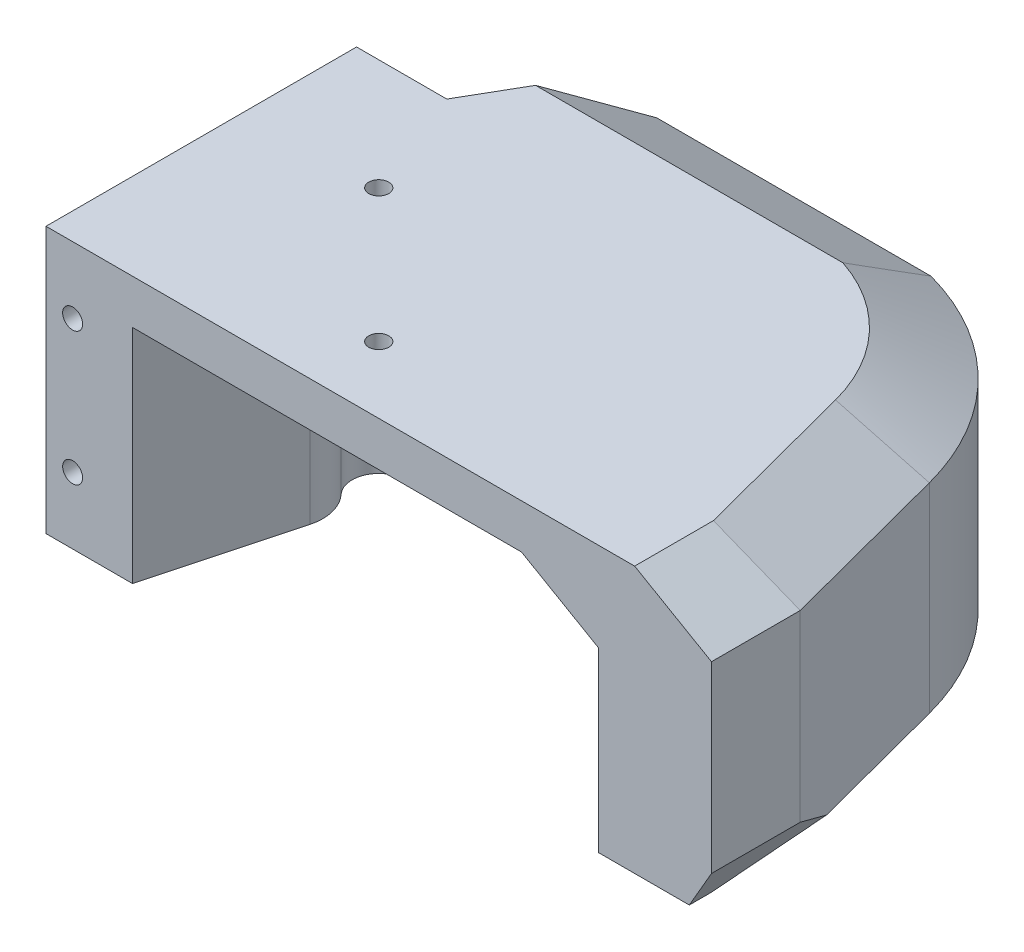
ISO-10303-21;
HEADER;
FILE_DESCRIPTION(('STEP AP214'),'2;1');
FILE_NAME('part.step','',(''),(''),'','','');
FILE_SCHEMA(('AUTOMOTIVE_DESIGN { 1 0 10303 214 1 1 1 1 }'));
ENDSEC;
DATA;
#1=APPLICATION_CONTEXT('core data for automotive mechanical design processes');
#2=APPLICATION_PROTOCOL_DEFINITION('international standard','automotive_design',2000,#1);
#3=PRODUCT_CONTEXT('',#1,'mechanical');
#4=PRODUCT('Part','Part','',(#3));
#5=PRODUCT_RELATED_PRODUCT_CATEGORY('part','',(#4));
#6=PRODUCT_DEFINITION_FORMATION('','',#4);
#7=PRODUCT_DEFINITION_CONTEXT('part definition',#1,'design');
#8=PRODUCT_DEFINITION('design','',#6,#7);
#9=PRODUCT_DEFINITION_SHAPE('','',#8);
#10=(LENGTH_UNIT() NAMED_UNIT(*) SI_UNIT(.MILLI.,.METRE.));
#11=(NAMED_UNIT(*) PLANE_ANGLE_UNIT() SI_UNIT($,.RADIAN.));
#12=(NAMED_UNIT(*) SI_UNIT($,.STERADIAN.) SOLID_ANGLE_UNIT());
#13=UNCERTAINTY_MEASURE_WITH_UNIT(LENGTH_MEASURE(1.E-05),#10,'distance_accuracy_value','');
#14=(GEOMETRIC_REPRESENTATION_CONTEXT(3) GLOBAL_UNCERTAINTY_ASSIGNED_CONTEXT((#13)) GLOBAL_UNIT_ASSIGNED_CONTEXT((#10,
#11,#12)) REPRESENTATION_CONTEXT('',''));
#15=CARTESIAN_POINT('',(0.,0.,0.));
#16=DIRECTION('',(0.,0.,1.));
#17=DIRECTION('',(1.,0.,0.));
#18=AXIS2_PLACEMENT_3D('',#15,#16,#17);
#19=CARTESIAN_POINT('',(30.,0.,55.));
#20=DIRECTION('',(0.,1.,0.));
#21=DIRECTION('',(0.,0.,1.));
#22=AXIS2_PLACEMENT_3D('',#19,#20,#21);
#23=CYLINDRICAL_SURFACE('',#22,2.25);
#24=CARTESIAN_POINT('',(30.,60.,55.));
#25=DIRECTION('',(0.,1.,0.));
#26=DIRECTION('',(0.,0.,1.));
#27=AXIS2_PLACEMENT_3D('',#24,#25,#26);
#28=CIRCLE('',#27,2.25);
#29=CARTESIAN_POINT('',(30.,60.,57.25));
#30=VERTEX_POINT('',#29);
#31=EDGE_CURVE('E521',#30,#30,#28,.T.);
#32=ORIENTED_EDGE('',*,*,#31,.T.);
#33=EDGE_LOOP('',(#32));
#34=FACE_BOUND('',#33,.T.);
#35=CARTESIAN_POINT('',(30.,53.,55.));
#36=DIRECTION('',(0.,-1.,0.));
#37=DIRECTION('',(0.,0.,-1.));
#38=AXIS2_PLACEMENT_3D('',#35,#36,#37);
#39=CIRCLE('',#38,2.25);
#40=CARTESIAN_POINT('',(30.,53.,52.75));
#41=VERTEX_POINT('',#40);
#42=EDGE_CURVE('E49',#41,#41,#39,.F.);
#43=ORIENTED_EDGE('',*,*,#42,.F.);
#44=EDGE_LOOP('',(#43));
#45=FACE_BOUND('',#44,.T.);
#46=ADVANCED_FACE('F44',(#34,#45),#23,.F.);
#47=CARTESIAN_POINT('',(60.,0.,85.));
#48=DIRECTION('',(0.,1.,0.));
#49=DIRECTION('',(0.,0.,1.));
#50=AXIS2_PLACEMENT_3D('',#47,#48,#49);
#51=CYLINDRICAL_SURFACE('',#50,2.25);
#52=CARTESIAN_POINT('',(60.,60.,85.));
#53=DIRECTION('',(0.,1.,0.));
#54=DIRECTION('',(0.,0.,1.));
#55=AXIS2_PLACEMENT_3D('',#52,#53,#54);
#56=CIRCLE('',#55,2.25);
#57=CARTESIAN_POINT('',(60.,60.,87.25));
#58=VERTEX_POINT('',#57);
#59=EDGE_CURVE('E525',#58,#58,#56,.T.);
#60=ORIENTED_EDGE('',*,*,#59,.T.);
#61=EDGE_LOOP('',(#60));
#62=FACE_BOUND('',#61,.T.);
#63=CARTESIAN_POINT('',(60.,53.,85.));
#64=DIRECTION('',(0.,-1.,0.));
#65=DIRECTION('',(0.,0.,-1.));
#66=AXIS2_PLACEMENT_3D('',#63,#64,#65);
#67=CIRCLE('',#66,2.25);
#68=CARTESIAN_POINT('',(60.,53.,82.75));
#69=VERTEX_POINT('',#68);
#70=EDGE_CURVE('E398',#69,#69,#67,.F.);
#71=ORIENTED_EDGE('',*,*,#70,.F.);
#72=EDGE_LOOP('',(#71));
#73=FACE_BOUND('',#72,.T.);
#74=ADVANCED_FACE('F613',(#62,#73),#51,.F.);
#75=CARTESIAN_POINT('',(43.1937476868986,50.,11.5737298107783));
#76=DIRECTION('',(0.965925826289067,0.,0.258819045102525));
#77=DIRECTION('',(0.258819045102525,0.,-0.965925826289067));
#78=AXIS2_PLACEMENT_3D('',#75,#76,#77);
#79=PLANE('',#78);
#80=DIRECTION('',(0.,-1.,0.));
#81=VECTOR('',#80,1.);
#82=CARTESIAN_POINT('',(35.436672602816,50.,40.5235281427008));
#83=LINE('',#82,#81);
#84=CARTESIAN_POINT('',(35.436672602816,40.,40.5235281427008));
#85=VERTEX_POINT('',#84);
#86=CARTESIAN_POINT('',(35.436672602816,0.,40.5235281427008));
#87=VERTEX_POINT('',#86);
#88=EDGE_CURVE('E490',#85,#87,#83,.T.);
#89=ORIENTED_EDGE('',*,*,#88,.F.);
#90=DIRECTION('',(0.242648450294152,-0.347927022767095,-0.905576344875611));
#91=VECTOR('',#90,1.);
#92=CARTESIAN_POINT('',(41.4104892942583,31.4343064895313,18.2289407351354));
#93=LINE('',#92,#91);
#94=CARTESIAN_POINT('',(34.9625251936436,40.6798670926029,42.2930703640092));
#95=VERTEX_POINT('',#94);
#96=EDGE_CURVE('E267',#85,#95,#93,.F.);
#97=ORIENTED_EDGE('',*,*,#96,.T.);
#98=DIRECTION('',(0.,1.,0.));
#99=VECTOR('',#98,1.);
#100=CARTESIAN_POINT('',(34.9625251936436,0.,42.2930703640092));
#101=LINE('',#100,#99);
#102=CARTESIAN_POINT('',(34.9625251936436,0.,42.2930703640092));
#103=VERTEX_POINT('',#102);
#104=EDGE_CURVE('E253',#95,#103,#101,.F.);
#105=ORIENTED_EDGE('',*,*,#104,.T.);
#106=DIRECTION('',(-0.258819045102525,0.,0.965925826289067));
#107=VECTOR('',#106,1.);
#108=CARTESIAN_POINT('',(43.1937476868986,0.,11.5737298107783));
#109=LINE('',#108,#107);
#110=EDGE_CURVE('E503',#87,#103,#109,.T.);
#111=ORIENTED_EDGE('',*,*,#110,.F.);
#112=EDGE_LOOP('',(#89,#97,#105,#111));
#113=FACE_BOUND('',#112,.T.);
#114=ADVANCED_FACE('F580',(#113),#79,.T.);
#115=CARTESIAN_POINT('',(0.,0.,100.));
#116=DIRECTION('',(0.,1.,0.));
#117=DIRECTION('',(0.,0.,1.));
#118=AXIS2_PLACEMENT_3D('',#115,#116,#117);
#119=PLANE('',#118);
#120=DIRECTION('',(0.499999999999997,0.,-0.86602540378444));
#121=VECTOR('',#120,1.);
#122=CARTESIAN_POINT('',(18.9996939578862,0.,32.3205080756905));
#123=LINE('',#122,#121);
#124=CARTESIAN_POINT('',(20.3394399200428,0.,30.));
#125=VERTEX_POINT('',#124);
#126=CARTESIAN_POINT('',(32.6599479957315,0.,8.66025403784442));
#127=VERTEX_POINT('',#126);
#128=EDGE_CURVE('E287',#125,#127,#123,.T.);
#129=ORIENTED_EDGE('',*,*,#128,.T.);
#130=DIRECTION('',(1.,0.,0.));
#131=VECTOR('',#130,1.);
#132=CARTESIAN_POINT('',(99.4666295470957,0.,8.66025403784443));
#133=LINE('',#132,#131);
#134=CARTESIAN_POINT('',(98.2607770074448,0.,8.66025403784443));
#135=VERTEX_POINT('',#134);
#136=EDGE_CURVE('E421',#127,#135,#133,.T.);
#137=ORIENTED_EDGE('',*,*,#136,.T.);
#138=CARTESIAN_POINT('',(84.5,0.,55.));
#139=DIRECTION('',(0.,1.,0.));
#140=DIRECTION('',(0.,0.,1.));
#141=AXIS2_PLACEMENT_3D('',#138,#139,#140);
#142=CIRCLE('',#141,48.3397459621556);
#143=CARTESIAN_POINT('',(131.253841762303,0.,42.7195553764817));
#144=VERTEX_POINT('',#143);
#145=EDGE_CURVE('E423',#135,#144,#142,.F.);
#146=ORIENTED_EDGE('',*,*,#145,.T.);
#147=DIRECTION('',(0.254044459255794,0.,0.967192541700685));
#148=VECTOR('',#147,1.);
#149=CARTESIAN_POINT('',(136.85727691863,0.,64.0528318706025));
#150=LINE('',#149,#148);
#151=CARTESIAN_POINT('',(145.,0.,95.0536301423143));
#152=VERTEX_POINT('',#151);
#153=EDGE_CURVE('E425',#144,#152,#150,.T.);
#154=ORIENTED_EDGE('',*,*,#153,.T.);
#155=DIRECTION('',(0.,0.,1.));
#156=VECTOR('',#155,1.);
#157=CARTESIAN_POINT('',(145.,0.,100.));
#158=LINE('',#157,#156);
#159=CARTESIAN_POINT('',(145.,0.,100.));
#160=VERTEX_POINT('',#159);
#161=EDGE_CURVE('E427',#152,#160,#158,.T.);
#162=ORIENTED_EDGE('',*,*,#161,.T.);
#163=DIRECTION('',(1.,0.,0.));
#164=VECTOR('',#163,1.);
#165=CARTESIAN_POINT('',(0.,0.,100.));
#166=LINE('',#165,#164);
#167=CARTESIAN_POINT('',(124.5,0.,100.));
#168=VERTEX_POINT('',#167);
#169=EDGE_CURVE('E477',#168,#160,#166,.T.);
#170=ORIENTED_EDGE('',*,*,#169,.F.);
#171=DIRECTION('',(0.,0.,-1.));
#172=VECTOR('',#171,1.);
#173=CARTESIAN_POINT('',(124.5,0.,0.));
#174=LINE('',#173,#172);
#175=CARTESIAN_POINT('',(124.5,0.,55.));
#176=VERTEX_POINT('',#175);
#177=EDGE_CURVE('E508',#168,#176,#174,.T.);
#178=ORIENTED_EDGE('',*,*,#177,.T.);
#179=CARTESIAN_POINT('',(84.5,0.,55.));
#180=DIRECTION('',(0.,-1.,0.));
#181=DIRECTION('',(0.,0.,-1.));
#182=AXIS2_PLACEMENT_3D('',#179,#180,#181);
#183=CIRCLE('',#182,40.);
#184=CARTESIAN_POINT('',(61.5569425459583,0.,22.2339182284402));
#185=VERTEX_POINT('',#184);
#186=EDGE_CURVE('E510',#185,#176,#183,.T.);
#187=ORIENTED_EDGE('',*,*,#186,.F.);
#188=DIRECTION('',(-0.819152044288995,0.,0.573576436351042));
#189=VECTOR('',#188,1.);
#190=CARTESIAN_POINT('',(30.6981385620608,0.,43.8414853981008));
#191=LINE('',#190,#189);
#192=EDGE_CURVE('E513',#185,#87,#191,.T.);
#193=ORIENTED_EDGE('',*,*,#192,.T.);
#194=ORIENTED_EDGE('',*,*,#110,.T.);
#195=CARTESIAN_POINT('',(25.3032669307529,0.,39.704879912984));
#196=DIRECTION('',(0.,1.,0.));
#197=DIRECTION('',(0.,0.,1.));
#198=AXIS2_PLACEMENT_3D('',#195,#196,#197);
#199=CIRCLE('',#198,10.);
#200=CARTESIAN_POINT('',(28.2387250990323,0.,49.264329967369));
#201=VERTEX_POINT('',#200);
#202=EDGE_CURVE('E257',#103,#201,#199,.F.);
#203=ORIENTED_EDGE('',*,*,#202,.T.);
#204=CARTESIAN_POINT('',(30.,0.,55.));
#205=DIRECTION('',(0.,-1.,0.));
#206=DIRECTION('',(0.,0.,-1.));
#207=AXIS2_PLACEMENT_3D('',#204,#205,#206);
#208=CIRCLE('',#207,6.);
#209=CARTESIAN_POINT('',(25.6068561763985,0.,59.0865985054997));
#210=VERTEX_POINT('',#209);
#211=EDGE_CURVE('E295',#210,#201,#208,.T.);
#212=ORIENTED_EDGE('',*,*,#211,.F.);
#213=CARTESIAN_POINT('',(18.2849498037295,0.,65.8975960146659));
#214=DIRECTION('',(0.,1.,0.));
#215=DIRECTION('',(0.,0.,1.));
#216=AXIS2_PLACEMENT_3D('',#213,#214,#215);
#217=CIRCLE('',#216,10.);
#218=CARTESIAN_POINT('',(27.9442080666201,0.,68.4857864656912));
#219=VERTEX_POINT('',#218);
#220=EDGE_CURVE('E255',#210,#219,#217,.F.);
#221=ORIENTED_EDGE('',*,*,#220,.T.);
#222=CARTESIAN_POINT('',(19.5,0.,100.));
#223=VERTEX_POINT('',#222);
#224=EDGE_CURVE('E507',#219,#223,#109,.T.);
#225=ORIENTED_EDGE('',*,*,#224,.T.);
#226=CARTESIAN_POINT('',(0.,0.,100.));
#227=VERTEX_POINT('',#226);
#228=EDGE_CURVE('E481',#227,#223,#166,.T.);
#229=ORIENTED_EDGE('',*,*,#228,.F.);
#230=DIRECTION('',(0.,0.,-1.));
#231=VECTOR('',#230,1.);
#232=CARTESIAN_POINT('',(0.,0.,100.));
#233=LINE('',#232,#231);
#234=CARTESIAN_POINT('',(0.,0.,30.));
#235=VERTEX_POINT('',#234);
#236=EDGE_CURVE('E237',#227,#235,#233,.T.);
#237=ORIENTED_EDGE('',*,*,#236,.T.);
#238=DIRECTION('',(-1.,0.,0.));
#239=VECTOR('',#238,1.);
#240=CARTESIAN_POINT('',(19.6214722227974,0.,30.));
#241=LINE('',#240,#239);
#242=EDGE_CURVE('E217',#125,#235,#241,.T.);
#243=ORIENTED_EDGE('',*,*,#242,.F.);
#244=EDGE_LOOP('',(#129,#137,#146,#154,#162,#170,#178,#187,#193,#194,#203,#212,#221,#225,#229,
#237,#243));
#245=FACE_BOUND('',#244,.T.);
#246=ADVANCED_FACE('F468',(#245),#119,.F.);
#247=CARTESIAN_POINT('',(0.,0.,100.));
#248=DIRECTION('',(0.,0.,-1.));
#249=DIRECTION('',(-1.,0.,0.));
#250=AXIS2_PLACEMENT_3D('',#247,#248,#249);
#251=PLANE('',#250);
#252=CARTESIAN_POINT('',(5.99999999999998,15.,100.));
#253=DIRECTION('',(0.,0.,1.));
#254=DIRECTION('',(1.,0.,0.));
#255=AXIS2_PLACEMENT_3D('',#252,#253,#254);
#256=CIRCLE('',#255,2.25);
#257=CARTESIAN_POINT('',(8.24999999999998,15.,100.));
#258=VERTEX_POINT('',#257);
#259=EDGE_CURVE('E487',#258,#258,#256,.T.);
#260=ORIENTED_EDGE('',*,*,#259,.F.);
#261=EDGE_LOOP('',(#260));
#262=FACE_BOUND('',#261,.T.);
#263=CARTESIAN_POINT('',(5.99999999999998,45.,100.));
#264=DIRECTION('',(0.,0.,1.));
#265=DIRECTION('',(1.,0.,0.));
#266=AXIS2_PLACEMENT_3D('',#263,#264,#265);
#267=CIRCLE('',#266,2.25);
#268=CARTESIAN_POINT('',(8.24999999999998,45.,100.));
#269=VERTEX_POINT('',#268);
#270=EDGE_CURVE('E484',#269,#269,#267,.T.);
#271=ORIENTED_EDGE('',*,*,#270,.F.);
#272=EDGE_LOOP('',(#271));
#273=FACE_BOUND('',#272,.T.);
#274=ORIENTED_EDGE('',*,*,#169,.T.);
#275=DIRECTION('',(-0.500000000000001,-0.866025403784438,0.));
#276=VECTOR('',#275,1.);
#277=CARTESIAN_POINT('',(150.,8.66025403784443,100.));
#278=LINE('',#277,#276);
#279=CARTESIAN_POINT('',(150.,8.66025403784443,100.));
#280=VERTEX_POINT('',#279);
#281=EDGE_CURVE('E11',#160,#280,#278,.F.);
#282=ORIENTED_EDGE('',*,*,#281,.T.);
#283=DIRECTION('',(0.,1.,0.));
#284=VECTOR('',#283,1.);
#285=CARTESIAN_POINT('',(150.,0.,100.));
#286=LINE('',#285,#284);
#287=CARTESIAN_POINT('',(150.,50.,100.));
#288=VERTEX_POINT('',#287);
#289=EDGE_CURVE('E242',#280,#288,#286,.T.);
#290=ORIENTED_EDGE('',*,*,#289,.T.);
#291=DIRECTION('',(0.866025403784438,-0.5,0.));
#292=VECTOR('',#291,1.);
#293=CARTESIAN_POINT('',(132.679491924311,60.,100.));
#294=LINE('',#293,#292);
#295=CARTESIAN_POINT('',(132.679491924311,60.,100.));
#296=VERTEX_POINT('',#295);
#297=EDGE_CURVE('E318',#288,#296,#294,.F.);
#298=ORIENTED_EDGE('',*,*,#297,.T.);
#299=DIRECTION('',(-1.,0.,0.));
#300=VECTOR('',#299,1.);
#301=CARTESIAN_POINT('',(0.,60.,100.));
#302=LINE('',#301,#300);
#303=CARTESIAN_POINT('',(0.,60.,100.));
#304=VERTEX_POINT('',#303);
#305=EDGE_CURVE('E238',#296,#304,#302,.T.);
#306=ORIENTED_EDGE('',*,*,#305,.T.);
#307=DIRECTION('',(0.,-1.,0.));
#308=VECTOR('',#307,1.);
#309=CARTESIAN_POINT('',(0.,0.,100.));
#310=LINE('',#309,#308);
#311=EDGE_CURVE('E236',#304,#227,#310,.T.);
#312=ORIENTED_EDGE('',*,*,#311,.T.);
#313=ORIENTED_EDGE('',*,*,#228,.T.);
#314=DIRECTION('',(0.,-1.,0.));
#315=VECTOR('',#314,1.);
#316=CARTESIAN_POINT('',(19.5,50.,100.));
#317=LINE('',#316,#315);
#318=CARTESIAN_POINT('',(19.5,50.,100.));
#319=VERTEX_POINT('',#318);
#320=EDGE_CURVE('E499',#319,#223,#317,.T.);
#321=ORIENTED_EDGE('',*,*,#320,.F.);
#322=DIRECTION('',(-1.,0.,0.));
#323=VECTOR('',#322,1.);
#324=CARTESIAN_POINT('',(0.,50.,100.));
#325=LINE('',#324,#323);
#326=CARTESIAN_POINT('',(107.179491924311,50.,100.));
#327=VERTEX_POINT('',#326);
#328=EDGE_CURVE('E506',#327,#319,#325,.T.);
#329=ORIENTED_EDGE('',*,*,#328,.F.);
#330=DIRECTION('',(-0.866025403784442,0.499999999999995,0.));
#331=VECTOR('',#330,1.);
#332=CARTESIAN_POINT('',(48.445508075688,83.9100813855811,100.));
#333=LINE('',#332,#331);
#334=CARTESIAN_POINT('',(124.5,40.,100.));
#335=VERTEX_POINT('',#334);
#336=EDGE_CURVE('E285',#327,#335,#333,.F.);
#337=ORIENTED_EDGE('',*,*,#336,.T.);
#338=DIRECTION('',(0.,-1.,0.));
#339=VECTOR('',#338,1.);
#340=CARTESIAN_POINT('',(124.5,50.,100.));
#341=LINE('',#340,#339);
#342=EDGE_CURVE('E479',#335,#168,#341,.T.);
#343=ORIENTED_EDGE('',*,*,#342,.T.);
#344=EDGE_LOOP('',(#274,#282,#290,#298,#306,#312,#313,#321,#329,#337,#343));
#345=FACE_BOUND('',#344,.T.);
#346=ADVANCED_FACE('F458',(#262,#273,#345),#251,.F.);
#347=CARTESIAN_POINT('',(0.,0.,100.));
#348=DIRECTION('',(1.,0.,0.));
#349=DIRECTION('',(0.,1.,0.));
#350=AXIS2_PLACEMENT_3D('',#347,#348,#349);
#351=PLANE('',#350);
#352=DIRECTION('',(0.,0.,-1.));
#353=VECTOR('',#352,1.);
#354=CARTESIAN_POINT('',(0.,60.,100.));
#355=LINE('',#354,#353);
#356=CARTESIAN_POINT('',(0.,60.,30.));
#357=VERTEX_POINT('',#356);
#358=EDGE_CURVE('E228',#304,#357,#355,.T.);
#359=ORIENTED_EDGE('',*,*,#358,.T.);
#360=DIRECTION('',(0.,-1.,0.));
#361=VECTOR('',#360,1.);
#362=CARTESIAN_POINT('',(0.,60.,30.));
#363=LINE('',#362,#361);
#364=EDGE_CURVE('E210',#357,#235,#363,.T.);
#365=ORIENTED_EDGE('',*,*,#364,.T.);
#366=ORIENTED_EDGE('',*,*,#236,.F.);
#367=ORIENTED_EDGE('',*,*,#311,.F.);
#368=EDGE_LOOP('',(#359,#365,#366,#367));
#369=FACE_BOUND('',#368,.T.);
#370=ADVANCED_FACE('F234',(#369),#351,.F.);
#371=CARTESIAN_POINT('',(150.,0.,100.));
#372=DIRECTION('',(-1.,0.,0.));
#373=DIRECTION('',(0.,0.,1.));
#374=AXIS2_PLACEMENT_3D('',#371,#372,#373);
#375=PLANE('',#374);
#376=ORIENTED_EDGE('',*,*,#289,.F.);
#377=DIRECTION('',(0.,0.,-1.));
#378=VECTOR('',#377,1.);
#379=CARTESIAN_POINT('',(150.,8.66025403784443,100.));
#380=LINE('',#379,#378);
#381=CARTESIAN_POINT('',(150.,8.66025403784443,80.));
#382=VERTEX_POINT('',#381);
#383=EDGE_CURVE('E54',#280,#382,#380,.T.);
#384=ORIENTED_EDGE('',*,*,#383,.T.);
#385=DIRECTION('',(0.,-1.,0.));
#386=VECTOR('',#385,1.);
#387=CARTESIAN_POINT('',(150.,60.,80.));
#388=LINE('',#387,#386);
#389=CARTESIAN_POINT('',(150.,50.,80.));
#390=VERTEX_POINT('',#389);
#391=EDGE_CURVE('E446',#390,#382,#388,.T.);
#392=ORIENTED_EDGE('',*,*,#391,.F.);
#393=DIRECTION('',(0.,0.,1.));
#394=VECTOR('',#393,1.);
#395=CARTESIAN_POINT('',(150.,50.,100.));
#396=LINE('',#395,#394);
#397=EDGE_CURVE('E315',#390,#288,#396,.T.);
#398=ORIENTED_EDGE('',*,*,#397,.T.);
#399=EDGE_LOOP('',(#376,#384,#392,#398));
#400=FACE_BOUND('',#399,.T.);
#401=ADVANCED_FACE('F452',(#400),#375,.F.);
#402=CARTESIAN_POINT('',(0.,60.,100.));
#403=DIRECTION('',(0.,-1.,0.));
#404=DIRECTION('',(0.,0.,-1.));
#405=AXIS2_PLACEMENT_3D('',#402,#403,#404);
#406=PLANE('',#405);
#407=ORIENTED_EDGE('',*,*,#31,.F.);
#408=EDGE_LOOP('',(#407));
#409=FACE_BOUND('',#408,.T.);
#410=ORIENTED_EDGE('',*,*,#59,.F.);
#411=EDGE_LOOP('',(#410));
#412=FACE_BOUND('',#411,.T.);
#413=DIRECTION('',(-0.499999999999997,0.,0.86602540378444));
#414=VECTOR('',#413,1.);
#415=CARTESIAN_POINT('',(18.9996939578862,60.,32.3205080756905));
#416=LINE('',#415,#414);
#417=CARTESIAN_POINT('',(27.6599479957315,60.,17.3205080756888));
#418=VERTEX_POINT('',#417);
#419=CARTESIAN_POINT('',(20.3394399200428,60.,30.));
#420=VERTEX_POINT('',#419);
#421=EDGE_CURVE('E231',#418,#420,#416,.T.);
#422=ORIENTED_EDGE('',*,*,#421,.T.);
#423=DIRECTION('',(-1.,0.,0.));
#424=VECTOR('',#423,1.);
#425=CARTESIAN_POINT('',(19.6214722227974,60.,30.));
#426=LINE('',#425,#424);
#427=EDGE_CURVE('E215',#420,#357,#426,.T.);
#428=ORIENTED_EDGE('',*,*,#427,.T.);
#429=ORIENTED_EDGE('',*,*,#358,.F.);
#430=ORIENTED_EDGE('',*,*,#305,.F.);
#431=DIRECTION('',(0.,0.,-1.));
#432=VECTOR('',#431,1.);
#433=CARTESIAN_POINT('',(132.679491924311,60.,100.));
#434=LINE('',#433,#432);
#435=CARTESIAN_POINT('',(132.679491924311,60.,82.2367811054835));
#436=VERTEX_POINT('',#435);
#437=EDGE_CURVE('E302',#296,#436,#434,.T.);
#438=ORIENTED_EDGE('',*,*,#437,.T.);
#439=DIRECTION('',(-0.254044459255794,0.,-0.967192541700685));
#440=VECTOR('',#439,1.);
#441=CARTESIAN_POINT('',(128.481143803994,60.,66.2529214246645));
#442=LINE('',#441,#440);
#443=CARTESIAN_POINT('',(122.877708647666,60.,44.9196449305437));
#444=VERTEX_POINT('',#443);
#445=EDGE_CURVE('E304',#436,#444,#442,.T.);
#446=ORIENTED_EDGE('',*,*,#445,.T.);
#447=CARTESIAN_POINT('',(84.5,60.,55.));
#448=DIRECTION('',(0.,-1.,0.));
#449=DIRECTION('',(0.,0.,-1.));
#450=AXIS2_PLACEMENT_3D('',#447,#448,#449);
#451=CIRCLE('',#450,39.6794919243112);
#452=CARTESIAN_POINT('',(96.9385677510413,60.,17.3205080756888));
#453=VERTEX_POINT('',#452);
#454=EDGE_CURVE('E306',#444,#453,#451,.F.);
#455=ORIENTED_EDGE('',*,*,#454,.T.);
#456=DIRECTION('',(-1.,0.,0.));
#457=VECTOR('',#456,1.);
#458=CARTESIAN_POINT('',(27.6599479957312,60.,17.3205080756888));
#459=LINE('',#458,#457);
#460=EDGE_CURVE('E308',#453,#418,#459,.T.);
#461=ORIENTED_EDGE('',*,*,#460,.T.);
#462=EDGE_LOOP('',(#422,#428,#429,#430,#438,#446,#455,#461));
#463=FACE_BOUND('',#462,.T.);
#464=ADVANCED_FACE('F226',(#409,#412,#463),#406,.F.);
#465=CARTESIAN_POINT('',(0.,0.,0.));
#466=DIRECTION('',(0.,0.,-1.));
#467=DIRECTION('',(-1.,0.,0.));
#468=AXIS2_PLACEMENT_3D('',#465,#466,#467);
#469=PLANE('',#468);
#470=DIRECTION('',(0.,-1.,0.));
#471=VECTOR('',#470,1.);
#472=CARTESIAN_POINT('',(99.4666295470957,60.,0.));
#473=LINE('',#472,#471);
#474=CARTESIAN_POINT('',(99.4666295470957,50.,0.));
#475=VERTEX_POINT('',#474);
#476=CARTESIAN_POINT('',(99.4666295470957,5.00000000000003,0.));
#477=VERTEX_POINT('',#476);
#478=EDGE_CURVE('E455',#475,#477,#473,.T.);
#479=ORIENTED_EDGE('',*,*,#478,.T.);
#480=DIRECTION('',(-1.,0.,0.));
#481=VECTOR('',#480,1.);
#482=CARTESIAN_POINT('',(37.6599479957314,5.00000000000003,0.));
#483=LINE('',#482,#481);
#484=CARTESIAN_POINT('',(37.6599479957314,5.00000000000003,0.));
#485=VERTEX_POINT('',#484);
#486=EDGE_CURVE('E68',#477,#485,#483,.T.);
#487=ORIENTED_EDGE('',*,*,#486,.T.);
#488=DIRECTION('',(0.,1.,0.));
#489=VECTOR('',#488,1.);
#490=CARTESIAN_POINT('',(37.6599479957314,60.,0.));
#491=LINE('',#490,#489);
#492=CARTESIAN_POINT('',(37.6599479957314,50.,0.));
#493=VERTEX_POINT('',#492);
#494=EDGE_CURVE('E300',#485,#493,#491,.T.);
#495=ORIENTED_EDGE('',*,*,#494,.T.);
#496=DIRECTION('',(1.,0.,0.));
#497=VECTOR('',#496,1.);
#498=CARTESIAN_POINT('',(99.4666295470957,50.,0.));
#499=LINE('',#498,#497);
#500=EDGE_CURVE('E298',#493,#475,#499,.T.);
#501=ORIENTED_EDGE('',*,*,#500,.T.);
#502=EDGE_LOOP('',(#479,#487,#495,#501));
#503=FACE_BOUND('',#502,.T.);
#504=ADVANCED_FACE('F648',(#503),#469,.T.);
#505=CARTESIAN_POINT('',(5.99999999999998,15.,0.));
#506=DIRECTION('',(0.,0.,1.));
#507=DIRECTION('',(1.,0.,0.));
#508=AXIS2_PLACEMENT_3D('',#505,#506,#507);
#509=CYLINDRICAL_SURFACE('',#508,2.25);
#510=CARTESIAN_POINT('',(5.99999999999998,15.,30.));
#511=DIRECTION('',(0.,0.,1.));
#512=DIRECTION('',(1.,0.,0.));
#513=AXIS2_PLACEMENT_3D('',#510,#511,#512);
#514=CIRCLE('',#513,2.25);
#515=CARTESIAN_POINT('',(8.24999999999998,15.,30.));
#516=VERTEX_POINT('',#515);
#517=EDGE_CURVE('E248',#516,#516,#514,.F.);
#518=ORIENTED_EDGE('',*,*,#517,.T.);
#519=EDGE_LOOP('',(#518));
#520=FACE_BOUND('',#519,.T.);
#521=ORIENTED_EDGE('',*,*,#259,.T.);
#522=EDGE_LOOP('',(#521));
#523=FACE_BOUND('',#522,.T.);
#524=ADVANCED_FACE('F644',(#520,#523),#509,.F.);
#525=CARTESIAN_POINT('',(5.99999999999998,45.,0.));
#526=DIRECTION('',(0.,0.,1.));
#527=DIRECTION('',(1.,0.,0.));
#528=AXIS2_PLACEMENT_3D('',#525,#526,#527);
#529=CYLINDRICAL_SURFACE('',#528,2.25);
#530=CARTESIAN_POINT('',(5.99999999999998,45.,30.));
#531=DIRECTION('',(0.,0.,1.));
#532=DIRECTION('',(1.,0.,0.));
#533=AXIS2_PLACEMENT_3D('',#530,#531,#532);
#534=CIRCLE('',#533,2.25);
#535=CARTESIAN_POINT('',(8.24999999999998,45.,30.));
#536=VERTEX_POINT('',#535);
#537=EDGE_CURVE('E222',#536,#536,#534,.F.);
#538=ORIENTED_EDGE('',*,*,#537,.T.);
#539=EDGE_LOOP('',(#538));
#540=FACE_BOUND('',#539,.T.);
#541=ORIENTED_EDGE('',*,*,#270,.T.);
#542=EDGE_LOOP('',(#541));
#543=FACE_BOUND('',#542,.T.);
#544=ADVANCED_FACE('F610',(#540,#543),#529,.F.);
#545=CARTESIAN_POINT('',(30.6981385620608,50.,43.8414853981008));
#546=DIRECTION('',(0.573576436351042,0.,0.819152044288995));
#547=DIRECTION('',(0.819152044288995,0.,-0.573576436351042));
#548=AXIS2_PLACEMENT_3D('',#545,#546,#547);
#549=PLANE('',#548);
#550=DIRECTION('',(0.,-1.,0.));
#551=VECTOR('',#550,1.);
#552=CARTESIAN_POINT('',(61.5569425459583,50.,22.2339182284402));
#553=LINE('',#552,#551);
#554=CARTESIAN_POINT('',(61.5569425459583,40.,22.2339182284402));
#555=VERTEX_POINT('',#554);
#556=EDGE_CURVE('E493',#555,#185,#553,.T.);
#557=ORIENTED_EDGE('',*,*,#556,.F.);
#558=DIRECTION('',(-0.819152044288995,0.,0.573576436351042));
#559=VECTOR('',#558,1.);
#560=CARTESIAN_POINT('',(35.436672602816,40.,40.5235281427008));
#561=LINE('',#560,#559);
#562=EDGE_CURVE('E264',#555,#85,#561,.T.);
#563=ORIENTED_EDGE('',*,*,#562,.T.);
#564=ORIENTED_EDGE('',*,*,#88,.T.);
#565=ORIENTED_EDGE('',*,*,#192,.F.);
#566=EDGE_LOOP('',(#557,#563,#564,#565));
#567=FACE_BOUND('',#566,.T.);
#568=ADVANCED_FACE('F576',(#567),#549,.T.);
#569=ORIENTED_EDGE('',*,*,#224,.F.);
#570=DIRECTION('',(0.,1.,0.));
#571=VECTOR('',#570,1.);
#572=CARTESIAN_POINT('',(27.9442080666201,50.,68.4857864656912));
#573=LINE('',#572,#571);
#574=CARTESIAN_POINT('',(27.9442080666201,50.,68.4857864656912));
#575=VERTEX_POINT('',#574);
#576=EDGE_CURVE('E259',#219,#575,#573,.T.);
#577=ORIENTED_EDGE('',*,*,#576,.T.);
#578=DIRECTION('',(-0.258819045102525,0.,0.965925826289067));
#579=VECTOR('',#578,1.);
#580=CARTESIAN_POINT('',(43.1937476868986,50.,11.5737298107783));
#581=LINE('',#580,#579);
#582=EDGE_CURVE('E496',#575,#319,#581,.T.);
#583=ORIENTED_EDGE('',*,*,#582,.T.);
#584=ORIENTED_EDGE('',*,*,#320,.T.);
#585=EDGE_LOOP('',(#569,#577,#583,#584));
#586=FACE_BOUND('',#585,.T.);
#587=ADVANCED_FACE('F600',(#586),#79,.T.);
#588=CARTESIAN_POINT('',(124.5,50.,0.));
#589=DIRECTION('',(-1.,0.,0.));
#590=DIRECTION('',(0.,0.,1.));
#591=AXIS2_PLACEMENT_3D('',#588,#589,#590);
#592=PLANE('',#591);
#593=ORIENTED_EDGE('',*,*,#342,.F.);
#594=DIRECTION('',(0.,0.,-1.));
#595=VECTOR('',#594,1.);
#596=CARTESIAN_POINT('',(124.5,40.,55.));
#597=LINE('',#596,#595);
#598=CARTESIAN_POINT('',(124.5,40.,55.));
#599=VERTEX_POINT('',#598);
#600=EDGE_CURVE('E281',#335,#599,#597,.T.);
#601=ORIENTED_EDGE('',*,*,#600,.T.);
#602=DIRECTION('',(0.,-1.,0.));
#603=VECTOR('',#602,1.);
#604=CARTESIAN_POINT('',(124.5,50.,55.));
#605=LINE('',#604,#603);
#606=EDGE_CURVE('E495',#599,#176,#605,.T.);
#607=ORIENTED_EDGE('',*,*,#606,.T.);
#608=ORIENTED_EDGE('',*,*,#177,.F.);
#609=EDGE_LOOP('',(#593,#601,#607,#608));
#610=FACE_BOUND('',#609,.T.);
#611=ADVANCED_FACE('F568',(#610),#592,.T.);
#612=CARTESIAN_POINT('',(84.5,50.,55.));
#613=DIRECTION('',(0.,-1.,0.));
#614=DIRECTION('',(0.,0.,-1.));
#615=AXIS2_PLACEMENT_3D('',#612,#613,#614);
#616=CYLINDRICAL_SURFACE('',#615,40.);
#617=ORIENTED_EDGE('',*,*,#606,.F.);
#618=CARTESIAN_POINT('',(84.5,40.,55.));
#619=DIRECTION('',(0.,-1.,0.));
#620=DIRECTION('',(0.,0.,-1.));
#621=AXIS2_PLACEMENT_3D('',#618,#619,#620);
#622=CIRCLE('',#621,40.);
#623=EDGE_CURVE('E283',#599,#555,#622,.F.);
#624=ORIENTED_EDGE('',*,*,#623,.T.);
#625=ORIENTED_EDGE('',*,*,#556,.T.);
#626=ORIENTED_EDGE('',*,*,#186,.T.);
#627=EDGE_LOOP('',(#617,#624,#625,#626));
#628=FACE_BOUND('',#627,.T.);
#629=ADVANCED_FACE('F573',(#628),#616,.F.);
#630=CARTESIAN_POINT('',(0.,50.,0.));
#631=DIRECTION('',(0.,-1.,0.));
#632=DIRECTION('',(0.,0.,-1.));
#633=AXIS2_PLACEMENT_3D('',#630,#631,#632);
#634=PLANE('',#633);
#635=CARTESIAN_POINT('',(60.,50.,85.));
#636=DIRECTION('',(0.,-1.,0.));
#637=DIRECTION('',(0.,0.,-1.));
#638=AXIS2_PLACEMENT_3D('',#635,#636,#637);
#639=CIRCLE('',#638,4.50000000000001);
#640=CARTESIAN_POINT('',(60.,50.,80.5));
#641=VERTEX_POINT('',#640);
#642=EDGE_CURVE('E401',#641,#641,#639,.F.);
#643=ORIENTED_EDGE('',*,*,#642,.T.);
#644=EDGE_LOOP('',(#643));
#645=FACE_BOUND('',#644,.T.);
#646=CARTESIAN_POINT('',(18.2849498037295,50.,65.8975960146659));
#647=DIRECTION('',(0.,-1.,0.));
#648=DIRECTION('',(0.,0.,-1.));
#649=AXIS2_PLACEMENT_3D('',#646,#647,#648);
#650=CIRCLE('',#649,10.);
#651=CARTESIAN_POINT('',(28.2528558148857,50.,66.6981269339657));
#652=VERTEX_POINT('',#651);
#653=EDGE_CURVE('E261',#575,#652,#650,.F.);
#654=ORIENTED_EDGE('',*,*,#653,.T.);
#655=DIRECTION('',(0.819152044288995,0.,-0.573576436351042));
#656=VECTOR('',#655,1.);
#657=CARTESIAN_POINT('',(71.4915778438015,50.,36.422047826765));
#658=LINE('',#657,#656);
#659=CARTESIAN_POINT('',(71.4915778438015,50.,36.4220478267649));
#660=VERTEX_POINT('',#659);
#661=EDGE_CURVE('E279',#652,#660,#658,.T.);
#662=ORIENTED_EDGE('',*,*,#661,.T.);
#663=CARTESIAN_POINT('',(84.5,50.,55.));
#664=DIRECTION('',(0.,-1.,0.));
#665=DIRECTION('',(0.,0.,-1.));
#666=AXIS2_PLACEMENT_3D('',#663,#664,#665);
#667=CIRCLE('',#666,22.6794919243109);
#668=CARTESIAN_POINT('',(107.179491924311,50.,55.));
#669=VERTEX_POINT('',#668);
#670=EDGE_CURVE('E275',#660,#669,#667,.T.);
#671=ORIENTED_EDGE('',*,*,#670,.T.);
#672=DIRECTION('',(0.,0.,1.));
#673=VECTOR('',#672,1.);
#674=CARTESIAN_POINT('',(107.179491924311,50.,100.));
#675=LINE('',#674,#673);
#676=EDGE_CURVE('E277',#669,#327,#675,.T.);
#677=ORIENTED_EDGE('',*,*,#676,.T.);
#678=ORIENTED_EDGE('',*,*,#328,.T.);
#679=ORIENTED_EDGE('',*,*,#582,.F.);
#680=EDGE_LOOP('',(#654,#662,#671,#677,#678,#679));
#681=FACE_BOUND('',#680,.T.);
#682=ADVANCED_FACE('F560',(#645,#681),#634,.T.);
#683=CARTESIAN_POINT('',(19.6214722227974,60.,30.));
#684=DIRECTION('',(0.,0.,1.));
#685=DIRECTION('',(1.,0.,0.));
#686=AXIS2_PLACEMENT_3D('',#683,#684,#685);
#687=PLANE('',#686);
#688=ORIENTED_EDGE('',*,*,#537,.F.);
#689=EDGE_LOOP('',(#688));
#690=FACE_BOUND('',#689,.T.);
#691=ORIENTED_EDGE('',*,*,#242,.T.);
#692=ORIENTED_EDGE('',*,*,#364,.F.);
#693=ORIENTED_EDGE('',*,*,#427,.F.);
#694=DIRECTION('',(0.,-1.,0.));
#695=VECTOR('',#694,1.);
#696=CARTESIAN_POINT('',(20.3394399200428,60.,30.));
#697=LINE('',#696,#695);
#698=EDGE_CURVE('E320',#420,#125,#697,.T.);
#699=ORIENTED_EDGE('',*,*,#698,.T.);
#700=EDGE_LOOP('',(#691,#692,#693,#699));
#701=FACE_BOUND('',#700,.T.);
#702=ORIENTED_EDGE('',*,*,#517,.F.);
#703=EDGE_LOOP('',(#702));
#704=FACE_BOUND('',#703,.T.);
#705=ADVANCED_FACE('F212',(#690,#701,#704),#687,.F.);
#706=CARTESIAN_POINT('',(84.5,60.,55.));
#707=DIRECTION('',(0.,-1.,0.));
#708=DIRECTION('',(0.,0.,-1.));
#709=AXIS2_PLACEMENT_3D('',#706,#707,#708);
#710=CYLINDRICAL_SURFACE('',#709,57.);
#711=DIRECTION('',(0.,-1.,0.));
#712=VECTOR('',#711,1.);
#713=CARTESIAN_POINT('',(139.629974876939,60.,40.5194658224197));
#714=LINE('',#713,#712);
#715=CARTESIAN_POINT('',(139.629974876939,50.,40.5194658224197));
#716=VERTEX_POINT('',#715);
#717=CARTESIAN_POINT('',(139.629974876939,5.00000000000003,40.5194658224197));
#718=VERTEX_POINT('',#717);
#719=EDGE_CURVE('E449',#716,#718,#714,.T.);
#720=ORIENTED_EDGE('',*,*,#719,.T.);
#721=CARTESIAN_POINT('',(84.5,5.00000000000003,55.));
#722=DIRECTION('',(0.,1.,0.));
#723=DIRECTION('',(0.,0.,1.));
#724=AXIS2_PLACEMENT_3D('',#721,#722,#723);
#725=CIRCLE('',#724,57.);
#726=EDGE_CURVE('E419',#718,#477,#725,.T.);
#727=ORIENTED_EDGE('',*,*,#726,.T.);
#728=ORIENTED_EDGE('',*,*,#478,.F.);
#729=CARTESIAN_POINT('',(84.5,50.,55.));
#730=DIRECTION('',(0.,-1.,0.));
#731=DIRECTION('',(0.,0.,-1.));
#732=AXIS2_PLACEMENT_3D('',#729,#730,#731);
#733=CIRCLE('',#732,57.);
#734=EDGE_CURVE('E313',#475,#716,#733,.T.);
#735=ORIENTED_EDGE('',*,*,#734,.T.);
#736=EDGE_LOOP('',(#720,#727,#728,#735));
#737=FACE_BOUND('',#736,.T.);
#738=ADVANCED_FACE('F628',(#737),#710,.T.);
#739=CARTESIAN_POINT('',(139.629974876939,60.,40.5194658224197));
#740=DIRECTION('',(-0.967192541700685,0.,0.254044459255794));
#741=DIRECTION('',(0.254044459255794,0.,0.967192541700685));
#742=AXIS2_PLACEMENT_3D('',#739,#740,#741);
#743=PLANE('',#742);
#744=DIRECTION('',(0.232529177157849,0.402752349079578,0.88528002749479));
#745=VECTOR('',#744,1.);
#746=CARTESIAN_POINT('',(154.117068726953,15.7912262511796,95.6744145416235));
#747=LINE('',#746,#745);
#748=CARTESIAN_POINT('',(147.886751345948,5.00000000000003,71.9544856717383));
#749=VERTEX_POINT('',#748);
#750=EDGE_CURVE('E322',#382,#749,#747,.F.);
#751=ORIENTED_EDGE('',*,*,#750,.T.);
#752=DIRECTION('',(-0.254044459255794,0.,-0.967192541700685));
#753=VECTOR('',#752,1.);
#754=CARTESIAN_POINT('',(139.629974876939,5.00000000000003,40.5194658224197));
#755=LINE('',#754,#753);
#756=EDGE_CURVE('E429',#749,#718,#755,.T.);
#757=ORIENTED_EDGE('',*,*,#756,.T.);
#758=ORIENTED_EDGE('',*,*,#719,.F.);
#759=DIRECTION('',(0.254044459255794,0.,0.967192541700685));
#760=VECTOR('',#759,1.);
#761=CARTESIAN_POINT('',(139.629974876939,50.,40.5194658224197));
#762=LINE('',#761,#760);
#763=EDGE_CURVE('E311',#716,#390,#762,.T.);
#764=ORIENTED_EDGE('',*,*,#763,.T.);
#765=ORIENTED_EDGE('',*,*,#391,.T.);
#766=EDGE_LOOP('',(#751,#757,#758,#764,#765));
#767=FACE_BOUND('',#766,.T.);
#768=ADVANCED_FACE('F445',(#767),#743,.F.);
#769=CARTESIAN_POINT('',(30.,66.9705627484771,55.));
#770=DIRECTION('',(0.,-1.,0.));
#771=DIRECTION('',(0.,0.,-1.));
#772=AXIS2_PLACEMENT_3D('',#769,#770,#771);
#773=CYLINDRICAL_SURFACE('',#772,6.);
#774=DIRECTION('',(0.,-1.,0.));
#775=VECTOR('',#774,1.);
#776=CARTESIAN_POINT('',(28.2387250990323,66.9705627484771,49.264329967369));
#777=LINE('',#776,#775);
#778=CARTESIAN_POINT('',(28.2387250990323,41.7502215246184,49.264329967369));
#779=VERTEX_POINT('',#778);
#780=EDGE_CURVE('E250',#201,#779,#777,.F.);
#781=ORIENTED_EDGE('',*,*,#780,.T.);
#782=CARTESIAN_POINT('',(30.,45.0460899765035,55.));
#783=DIRECTION('',(0.286788218175518,-0.866025403784442,0.409576022144493));
#784=DIRECTION('',(-0.496731764892152,-0.499999999999995,-0.709406479916228));
#785=AXIS2_PLACEMENT_3D('',#782,#783,#784);
#786=ELLIPSE('',#785,6.92820323027549,6.);
#787=CARTESIAN_POINT('',(25.6068561763985,45.5239868936334,59.0865985054997));
#788=VERTEX_POINT('',#787);
#789=EDGE_CURVE('E271',#779,#788,#786,.F.);
#790=ORIENTED_EDGE('',*,*,#789,.T.);
#791=DIRECTION('',(0.,-1.,0.));
#792=VECTOR('',#791,1.);
#793=CARTESIAN_POINT('',(25.6068561763985,66.9705627484771,59.0865985054997));
#794=LINE('',#793,#792);
#795=EDGE_CURVE('E240',#788,#210,#794,.T.);
#796=ORIENTED_EDGE('',*,*,#795,.T.);
#797=ORIENTED_EDGE('',*,*,#211,.T.);
#798=EDGE_LOOP('',(#781,#790,#796,#797));
#799=FACE_BOUND('',#798,.T.);
#800=ADVANCED_FACE('F590',(#799),#773,.F.);
#801=CARTESIAN_POINT('',(25.3032669307529,66.9705627484771,39.704879912984));
#802=DIRECTION('',(0.,-1.,0.));
#803=DIRECTION('',(0.,0.,-1.));
#804=AXIS2_PLACEMENT_3D('',#801,#802,#803);
#805=CYLINDRICAL_SURFACE('',#804,10.);
#806=ORIENTED_EDGE('',*,*,#104,.F.);
#807=CARTESIAN_POINT('',(25.3032669307529,36.2571074381433,39.704879912984));
#808=DIRECTION('',(0.286788218175518,-0.866025403784442,0.409576022144493));
#809=DIRECTION('',(-0.496731764892152,-0.499999999999995,-0.709406479916228));
#810=AXIS2_PLACEMENT_3D('',#807,#808,#809);
#811=ELLIPSE('',#810,11.5470053837925,10.);
#812=EDGE_CURVE('E269',#95,#779,#811,.T.);
#813=ORIENTED_EDGE('',*,*,#812,.T.);
#814=ORIENTED_EDGE('',*,*,#780,.F.);
#815=ORIENTED_EDGE('',*,*,#202,.F.);
#816=EDGE_LOOP('',(#806,#813,#814,#815));
#817=FACE_BOUND('',#816,.T.);
#818=ADVANCED_FACE('F586',(#817),#805,.T.);
#819=CARTESIAN_POINT('',(18.2849498037295,66.9705627484771,65.8975960146659));
#820=DIRECTION('',(0.,-1.,0.));
#821=DIRECTION('',(0.,0.,-1.));
#822=AXIS2_PLACEMENT_3D('',#819,#820,#821);
#823=CYLINDRICAL_SURFACE('',#822,10.);
#824=ORIENTED_EDGE('',*,*,#795,.F.);
#825=CARTESIAN_POINT('',(18.2849498037295,46.3204817555166,65.8975960146659));
#826=DIRECTION('',(0.286788218175518,-0.866025403784442,0.409576022144493));
#827=DIRECTION('',(-0.496731764892152,-0.499999999999995,-0.709406479916228));
#828=AXIS2_PLACEMENT_3D('',#825,#826,#827);
#829=ELLIPSE('',#828,11.5470053837925,10.);
#830=EDGE_CURVE('E273',#788,#652,#829,.T.);
#831=ORIENTED_EDGE('',*,*,#830,.T.);
#832=ORIENTED_EDGE('',*,*,#653,.F.);
#833=ORIENTED_EDGE('',*,*,#576,.F.);
#834=ORIENTED_EDGE('',*,*,#220,.F.);
#835=EDGE_LOOP('',(#824,#831,#832,#833,#834));
#836=FACE_BOUND('',#835,.T.);
#837=ADVANCED_FACE('F594',(#836),#823,.T.);
#838=CARTESIAN_POINT('',(124.5,40.,0.));
#839=DIRECTION('',(-0.499999999999995,-0.866025403784442,0.));
#840=DIRECTION('',(0.,0.,1.));
#841=AXIS2_PLACEMENT_3D('',#838,#839,#840);
#842=PLANE('',#841);
#843=ORIENTED_EDGE('',*,*,#336,.F.);
#844=ORIENTED_EDGE('',*,*,#676,.F.);
#845=DIRECTION('',(-0.866025403784442,0.499999999999995,0.));
#846=VECTOR('',#845,1.);
#847=CARTESIAN_POINT('',(124.5,40.,55.));
#848=LINE('',#847,#846);
#849=EDGE_CURVE('E291',#599,#669,#848,.T.);
#850=ORIENTED_EDGE('',*,*,#849,.F.);
#851=ORIENTED_EDGE('',*,*,#600,.F.);
#852=EDGE_LOOP('',(#843,#844,#850,#851));
#853=FACE_BOUND('',#852,.T.);
#854=ADVANCED_FACE('F564',(#853),#842,.T.);
#855=CARTESIAN_POINT('',(84.5,50.,55.));
#856=DIRECTION('',(0.,-1.,0.));
#857=DIRECTION('',(0.,0.,-1.));
#858=AXIS2_PLACEMENT_3D('',#855,#856,#857);
#859=CONICAL_SURFACE('',#858,22.6794919243109,1.0471975511966);
#860=ORIENTED_EDGE('',*,*,#849,.T.);
#861=ORIENTED_EDGE('',*,*,#670,.F.);
#862=DIRECTION('',(0.496731764892152,0.499999999999995,0.709406479916227));
#863=VECTOR('',#862,1.);
#864=CARTESIAN_POINT('',(61.5569425459583,40.,22.2339182284402));
#865=LINE('',#864,#863);
#866=EDGE_CURVE('E288',#555,#660,#865,.T.);
#867=ORIENTED_EDGE('',*,*,#866,.F.);
#868=ORIENTED_EDGE('',*,*,#623,.F.);
#869=EDGE_LOOP('',(#860,#861,#867,#868));
#870=FACE_BOUND('',#869,.T.);
#871=ADVANCED_FACE('F548',(#870),#859,.F.);
#872=CARTESIAN_POINT('',(30.6981385620608,40.,43.8414853981008));
#873=DIRECTION('',(0.286788218175518,-0.866025403784442,0.409576022144493));
#874=DIRECTION('',(0.819152044288995,0.,-0.573576436351042));
#875=AXIS2_PLACEMENT_3D('',#872,#873,#874);
#876=PLANE('',#875);
#877=CARTESIAN_POINT('',(30.,45.0460899765035,55.));
#878=DIRECTION('',(0.286788218175518,-0.866025403784442,0.409576022144493));
#879=DIRECTION('',(0.496731764892152,0.499999999999995,0.709406479916228));
#880=AXIS2_PLACEMENT_3D('',#877,#878,#879);
#881=ELLIPSE('',#880,5.19615242270661,4.5);
#882=CARTESIAN_POINT('',(32.5810939635797,47.6441661878568,58.6861841993005));
#883=VERTEX_POINT('',#882);
#884=EDGE_CURVE('E395',#883,#883,#881,.T.);
#885=ORIENTED_EDGE('',*,*,#884,.F.);
#886=EDGE_LOOP('',(#885));
#887=FACE_BOUND('',#886,.T.);
#888=ORIENTED_EDGE('',*,*,#866,.T.);
#889=ORIENTED_EDGE('',*,*,#661,.F.);
#890=ORIENTED_EDGE('',*,*,#830,.F.);
#891=ORIENTED_EDGE('',*,*,#789,.F.);
#892=ORIENTED_EDGE('',*,*,#812,.F.);
#893=ORIENTED_EDGE('',*,*,#96,.F.);
#894=ORIENTED_EDGE('',*,*,#562,.F.);
#895=EDGE_LOOP('',(#888,#889,#890,#891,#892,#893,#894));
#896=FACE_BOUND('',#895,.T.);
#897=ADVANCED_FACE('F364',(#887,#896),#876,.T.);
#898=CARTESIAN_POINT('',(132.679491924311,60.,100.));
#899=DIRECTION('',(-0.5,-0.866025403784438,0.));
#900=DIRECTION('',(0.,0.,-1.));
#901=AXIS2_PLACEMENT_3D('',#898,#899,#900);
#902=PLANE('',#901);
#903=ORIENTED_EDGE('',*,*,#297,.F.);
#904=ORIENTED_EDGE('',*,*,#397,.F.);
#905=DIRECTION('',(-0.860659576623421,0.496902038244162,0.111146109042069));
#906=VECTOR('',#905,1.);
#907=CARTESIAN_POINT('',(130.980280822629,60.9810399869663,82.4562182761405));
#908=LINE('',#907,#906);
#909=EDGE_CURVE('E292',#436,#390,#908,.F.);
#910=ORIENTED_EDGE('',*,*,#909,.F.);
#911=ORIENTED_EDGE('',*,*,#437,.F.);
#912=EDGE_LOOP('',(#903,#904,#910,#911));
#913=FACE_BOUND('',#912,.T.);
#914=ADVANCED_FACE('F357',(#913),#902,.F.);
#915=CARTESIAN_POINT('',(128.481143803994,60.,66.2529214246645));
#916=DIRECTION('',(-0.483596270850343,-0.866025403784438,0.127022229627897));
#917=DIRECTION('',(-0.254044459255794,0.,-0.967192541700685));
#918=AXIS2_PLACEMENT_3D('',#915,#916,#917);
#919=PLANE('',#918);
#920=ORIENTED_EDGE('',*,*,#909,.T.);
#921=ORIENTED_EDGE('',*,*,#763,.F.);
#922=DIRECTION('',(0.837613311463633,-0.500000000000001,-0.220008955406199));
#923=VECTOR('',#922,1.);
#924=CARTESIAN_POINT('',(122.877708647666,60.,44.9196449305437));
#925=LINE('',#924,#923);
#926=EDGE_CURVE('E336',#444,#716,#925,.T.);
#927=ORIENTED_EDGE('',*,*,#926,.F.);
#928=ORIENTED_EDGE('',*,*,#445,.F.);
#929=EDGE_LOOP('',(#920,#921,#927,#928));
#930=FACE_BOUND('',#929,.T.);
#931=ADVANCED_FACE('F350',(#930),#919,.F.);
#932=CARTESIAN_POINT('',(84.5,60.,55.));
#933=DIRECTION('',(0.,-1.,0.));
#934=DIRECTION('',(0.,0.,-1.));
#935=AXIS2_PLACEMENT_3D('',#932,#933,#934);
#936=CONICAL_SURFACE('',#935,39.6794919243112,1.0471975511966);
#937=ORIENTED_EDGE('',*,*,#926,.T.);
#938=ORIENTED_EDGE('',*,*,#734,.F.);
#939=CARTESIAN_POINT('',(96.9385677510413,60.,17.3205080756888));
#940=CARTESIAN_POINT('',(97.1702012918859,59.1680164554038,15.8794703053869));
#941=CARTESIAN_POINT('',(97.3956254416632,58.3356063568641,14.4376937219827));
#942=CARTESIAN_POINT('',(97.8355571374424,56.6700923474558,11.5529388369699));
#943=CARTESIAN_POINT('',(98.0500650428331,55.8369884603474,10.109960576515));
#944=CARTESIAN_POINT('',(98.4696785544975,54.1702029991794,7.22300347245486));
#945=CARTESIAN_POINT('',(98.6747842923258,53.3365214333684,5.77902464313659));
#946=CARTESIAN_POINT('',(99.0766782990183,51.6686290030682,2.89015021229715));
#947=CARTESIAN_POINT('',(99.2734662943562,50.8344181220869,1.44525458221071));
#948=CARTESIAN_POINT('',(99.4666295470957,50.,0.));
#949=B_SPLINE_CURVE_WITH_KNOTS('',3,(#939,#940,#941,#942,#943,#944,#945,#946,#947,#948),
.UNSPECIFIED.,.F.,.F.,(4,2,2,2,4),(0.,5.04000845668367,10.0798508768307,15.1196227582223,
20.1595602422247),.UNSPECIFIED.);
#950=EDGE_CURVE('E326',#453,#475,#949,.T.);
#951=ORIENTED_EDGE('',*,*,#950,.F.);
#952=ORIENTED_EDGE('',*,*,#454,.F.);
#953=EDGE_LOOP('',(#937,#938,#951,#952));
#954=FACE_BOUND('',#953,.T.);
#955=ADVANCED_FACE('F343',(#954),#936,.T.);
#956=CARTESIAN_POINT('',(0.,60.,17.3205080756888));
#957=DIRECTION('',(0.,0.866025403784438,-0.500000000000001));
#958=DIRECTION('',(1.,0.,0.));
#959=AXIS2_PLACEMENT_3D('',#956,#957,#958);
#960=PLANE('',#959);
#961=ORIENTED_EDGE('',*,*,#950,.T.);
#962=ORIENTED_EDGE('',*,*,#500,.F.);
#963=DIRECTION('',(-0.447213595499955,0.447213595499959,0.774596669241484));
#964=VECTOR('',#963,1.);
#965=CARTESIAN_POINT('',(22.1279583965853,65.5319895991463,26.9021951283527));
#966=LINE('',#965,#964);
#967=EDGE_CURVE('E323',#418,#493,#966,.F.);
#968=ORIENTED_EDGE('',*,*,#967,.F.);
#969=ORIENTED_EDGE('',*,*,#460,.F.);
#970=EDGE_LOOP('',(#961,#962,#968,#969));
#971=FACE_BOUND('',#970,.T.);
#972=ADVANCED_FACE('F339',(#971),#960,.T.);
#973=CARTESIAN_POINT('',(18.9996939578862,60.,32.3205080756905));
#974=DIRECTION('',(-0.86602540378444,0.,-0.499999999999997));
#975=DIRECTION('',(0.,1.,0.));
#976=AXIS2_PLACEMENT_3D('',#973,#974,#975);
#977=PLANE('',#976);
#978=ORIENTED_EDGE('',*,*,#494,.F.);
#979=DIRECTION('',(-0.447213595499955,-0.447213595499959,0.774596669241484));
#980=VECTOR('',#979,1.);
#981=CARTESIAN_POINT('',(33.7317447654552,1.07179676972379,6.80384757729464));
#982=LINE('',#981,#980);
#983=EDGE_CURVE('E416',#485,#127,#982,.T.);
#984=ORIENTED_EDGE('',*,*,#983,.T.);
#985=ORIENTED_EDGE('',*,*,#128,.F.);
#986=ORIENTED_EDGE('',*,*,#698,.F.);
#987=ORIENTED_EDGE('',*,*,#421,.F.);
#988=ORIENTED_EDGE('',*,*,#967,.T.);
#989=EDGE_LOOP('',(#978,#984,#985,#986,#987,#988));
#990=FACE_BOUND('',#989,.T.);
#991=ADVANCED_FACE('F382',(#990),#977,.T.);
#992=CARTESIAN_POINT('',(0.,0.,8.66025403784443));
#993=DIRECTION('',(0.,-0.866025403784438,-0.500000000000001));
#994=DIRECTION('',(-1.,0.,0.));
#995=AXIS2_PLACEMENT_3D('',#992,#993,#994);
#996=PLANE('',#995);
#997=ORIENTED_EDGE('',*,*,#983,.F.);
#998=ORIENTED_EDGE('',*,*,#486,.F.);
#999=CARTESIAN_POINT('',(99.4666295470957,5.00000000000003,0.));
#1000=CARTESIAN_POINT('',(99.3701328740612,4.58309482916281,0.722100937828252));
#1001=CARTESIAN_POINT('',(99.2727189857475,4.16624259208704,1.44411019169223));
#1002=CARTESIAN_POINT('',(99.0759389432005,3.33265598543381,2.88792454692455));
#1003=CARTESIAN_POINT('',(98.9765728011153,2.91592161513928,3.6097296495349));
#1004=CARTESIAN_POINT('',(98.7757690960269,2.08257704847515,5.05312477920863));
#1005=CARTESIAN_POINT('',(98.6743315305061,1.66596685225711,5.77471480600953));
#1006=CARTESIAN_POINT('',(98.4692462723528,0.832879879441811,7.21766377004937));
#1007=CARTESIAN_POINT('',(98.3655985659724,0.416403103690855,7.93902270582249));
#1008=CARTESIAN_POINT('',(98.2607770074449,0.,8.66025403784443));
#1009=B_SPLINE_CURVE_WITH_KNOTS('',3,(#999,#1000,#1001,#1002,#1003,#1004,#1005,#1006,#1007,
#1008),.UNSPECIFIED.,.F.,.F.,(4,2,2,2,4),(0.,2.51812650684405,5.03623734923988,7.55435125231591,
10.0724808237089),.UNSPECIFIED.);
#1010=EDGE_CURVE('E327',#135,#477,#1009,.F.);
#1011=ORIENTED_EDGE('',*,*,#1010,.F.);
#1012=ORIENTED_EDGE('',*,*,#136,.F.);
#1013=EDGE_LOOP('',(#997,#998,#1011,#1012));
#1014=FACE_BOUND('',#1013,.T.);
#1015=ADVANCED_FACE('F376',(#1014),#996,.T.);
#1016=CARTESIAN_POINT('',(150.,8.66025403784443,100.));
#1017=DIRECTION('',(-0.866025403784438,0.500000000000001,0.));
#1018=DIRECTION('',(0.,0.,-1.));
#1019=AXIS2_PLACEMENT_3D('',#1016,#1017,#1018);
#1020=PLANE('',#1019);
#1021=ORIENTED_EDGE('',*,*,#281,.F.);
#1022=ORIENTED_EDGE('',*,*,#161,.F.);
#1023=DIRECTION('',(0.121242446052262,0.209998076596447,-0.970155181968873));
#1024=VECTOR('',#1023,1.);
#1025=CARTESIAN_POINT('',(144.712182869113,-0.498513893985126,97.3566790338646));
#1026=LINE('',#1025,#1024);
#1027=EDGE_CURVE('E393',#749,#152,#1026,.F.);
#1028=ORIENTED_EDGE('',*,*,#1027,.F.);
#1029=ORIENTED_EDGE('',*,*,#750,.F.);
#1030=ORIENTED_EDGE('',*,*,#383,.F.);
#1031=EDGE_LOOP('',(#1021,#1022,#1028,#1029,#1030));
#1032=FACE_BOUND('',#1031,.T.);
#1033=ADVANCED_FACE('F47',(#1032),#1020,.F.);
#1034=CARTESIAN_POINT('',(84.5,5.00000000000003,55.));
#1035=DIRECTION('',(0.,1.,0.));
#1036=DIRECTION('',(0.,0.,1.));
#1037=AXIS2_PLACEMENT_3D('',#1034,#1035,#1036);
#1038=CONICAL_SURFACE('',#1037,57.,1.0471975511966);
#1039=ORIENTED_EDGE('',*,*,#1010,.T.);
#1040=ORIENTED_EDGE('',*,*,#726,.F.);
#1041=DIRECTION('',(0.837613311463633,0.500000000000001,-0.220008955406198));
#1042=VECTOR('',#1041,1.);
#1043=CARTESIAN_POINT('',(131.253841762303,0.,42.7195553764817));
#1044=LINE('',#1043,#1042);
#1045=EDGE_CURVE('E406',#144,#718,#1044,.T.);
#1046=ORIENTED_EDGE('',*,*,#1045,.F.);
#1047=ORIENTED_EDGE('',*,*,#145,.F.);
#1048=EDGE_LOOP('',(#1039,#1040,#1046,#1047));
#1049=FACE_BOUND('',#1048,.T.);
#1050=ADVANCED_FACE('F374',(#1049),#1038,.T.);
#1051=CARTESIAN_POINT('',(139.629974876939,5.00000000000003,40.5194658224197));
#1052=DIRECTION('',(-0.483596270850344,0.866025403784438,0.127022229627897));
#1053=DIRECTION('',(-0.254044459255794,0.,-0.967192541700685));
#1054=AXIS2_PLACEMENT_3D('',#1051,#1052,#1053);
#1055=PLANE('',#1054);
#1056=ORIENTED_EDGE('',*,*,#1027,.T.);
#1057=ORIENTED_EDGE('',*,*,#153,.F.);
#1058=ORIENTED_EDGE('',*,*,#1045,.T.);
#1059=ORIENTED_EDGE('',*,*,#756,.F.);
#1060=EDGE_LOOP('',(#1056,#1057,#1058,#1059));
#1061=FACE_BOUND('',#1060,.T.);
#1062=ADVANCED_FACE('F367',(#1061),#1055,.F.);
#1063=CARTESIAN_POINT('',(30.,53.,55.));
#1064=DIRECTION('',(0.,-1.,0.));
#1065=DIRECTION('',(0.,0.,-1.));
#1066=AXIS2_PLACEMENT_3D('',#1063,#1064,#1065);
#1067=PLANE('',#1066);
#1068=CARTESIAN_POINT('',(30.,53.,55.));
#1069=DIRECTION('',(0.,-1.,0.));
#1070=DIRECTION('',(0.,0.,-1.));
#1071=AXIS2_PLACEMENT_3D('',#1068,#1069,#1070);
#1072=CIRCLE('',#1071,4.5);
#1073=CARTESIAN_POINT('',(30.,53.,50.5));
#1074=VERTEX_POINT('',#1073);
#1075=EDGE_CURVE('E399',#1074,#1074,#1072,.T.);
#1076=ORIENTED_EDGE('',*,*,#1075,.T.);
#1077=EDGE_LOOP('',(#1076));
#1078=FACE_BOUND('',#1077,.T.);
#1079=ORIENTED_EDGE('',*,*,#42,.T.);
#1080=EDGE_LOOP('',(#1079));
#1081=FACE_BOUND('',#1080,.T.);
#1082=ADVANCED_FACE('F373',(#1078,#1081),#1067,.T.);
#1083=CARTESIAN_POINT('',(30.,40.,55.));
#1084=DIRECTION('',(0.,1.,0.));
#1085=DIRECTION('',(0.,0.,1.));
#1086=AXIS2_PLACEMENT_3D('',#1083,#1084,#1085);
#1087=CYLINDRICAL_SURFACE('',#1086,4.5);
#1088=ORIENTED_EDGE('',*,*,#1075,.F.);
#1089=EDGE_LOOP('',(#1088));
#1090=FACE_BOUND('',#1089,.T.);
#1091=ORIENTED_EDGE('',*,*,#884,.T.);
#1092=EDGE_LOOP('',(#1091));
#1093=FACE_BOUND('',#1092,.T.);
#1094=ADVANCED_FACE('F539',(#1090,#1093),#1087,.F.);
#1095=CARTESIAN_POINT('',(60.,53.,85.));
#1096=DIRECTION('',(0.,-1.,0.));
#1097=DIRECTION('',(0.,0.,-1.));
#1098=AXIS2_PLACEMENT_3D('',#1095,#1096,#1097);
#1099=PLANE('',#1098);
#1100=CARTESIAN_POINT('',(60.,53.,85.));
#1101=DIRECTION('',(0.,-1.,0.));
#1102=DIRECTION('',(0.,0.,-1.));
#1103=AXIS2_PLACEMENT_3D('',#1100,#1101,#1102);
#1104=CIRCLE('',#1103,4.50000000000001);
#1105=CARTESIAN_POINT('',(60.,53.,80.5));
#1106=VERTEX_POINT('',#1105);
#1107=EDGE_CURVE('E532',#1106,#1106,#1104,.T.);
#1108=ORIENTED_EDGE('',*,*,#1107,.T.);
#1109=EDGE_LOOP('',(#1108));
#1110=FACE_BOUND('',#1109,.T.);
#1111=ORIENTED_EDGE('',*,*,#70,.T.);
#1112=EDGE_LOOP('',(#1111));
#1113=FACE_BOUND('',#1112,.T.);
#1114=ADVANCED_FACE('F542',(#1110,#1113),#1099,.T.);
#1115=CARTESIAN_POINT('',(60.,40.,85.));
#1116=DIRECTION('',(0.,1.,0.));
#1117=DIRECTION('',(0.,0.,1.));
#1118=AXIS2_PLACEMENT_3D('',#1115,#1116,#1117);
#1119=CYLINDRICAL_SURFACE('',#1118,4.50000000000001);
#1120=ORIENTED_EDGE('',*,*,#642,.F.);
#1121=EDGE_LOOP('',(#1120));
#1122=FACE_BOUND('',#1121,.T.);
#1123=ORIENTED_EDGE('',*,*,#1107,.F.);
#1124=EDGE_LOOP('',(#1123));
#1125=FACE_BOUND('',#1124,.T.);
#1126=ADVANCED_FACE('F845',(#1122,#1125),#1119,.F.);
#1127=CLOSED_SHELL('',(#46,#74,#114,#246,#346,#370,#401,#464,#504,#524,#544,#568,#587,#611,#629,
#682,#705,#738,#768,#800,#818,#837,#854,#871,#897,#914,#931,#955,#972,#991,#1015,#1033,#1050,
#1062,#1082,#1094,#1114,#1126));
#1128=MANIFOLD_SOLID_BREP('B2',#1127);
#1129=ADVANCED_BREP_SHAPE_REPRESENTATION('',(#18,#1128),#14);
#1130=SHAPE_DEFINITION_REPRESENTATION(#9,#1129);
ENDSEC;
END-ISO-10303-21;
